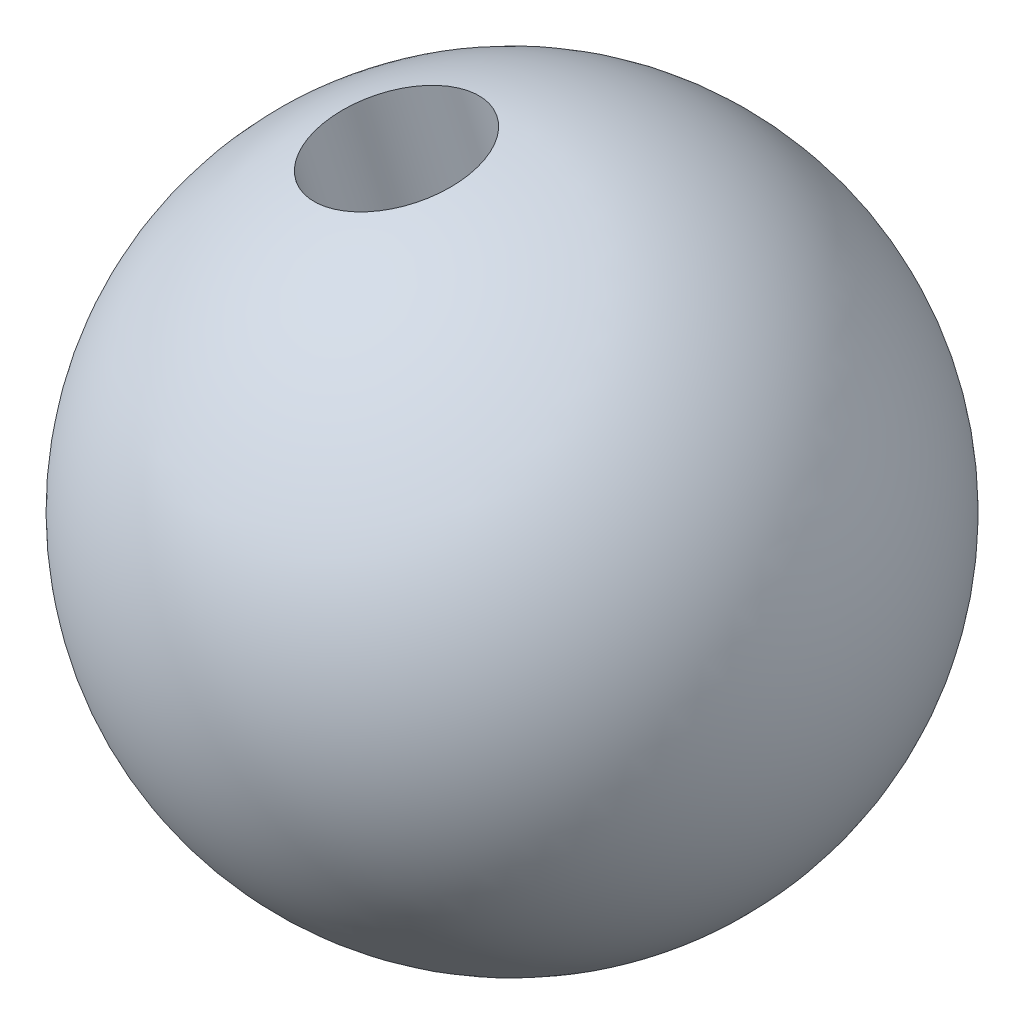
ISO-10303-21;
HEADER;
FILE_DESCRIPTION(('STEP AP214'),'2;1');
FILE_NAME('part.step','',(''),(''),'','','');
FILE_SCHEMA(('AUTOMOTIVE_DESIGN { 1 0 10303 214 1 1 1 1 }'));
ENDSEC;
DATA;
#1=APPLICATION_CONTEXT('core data for automotive mechanical design processes');
#2=APPLICATION_PROTOCOL_DEFINITION('international standard','automotive_design',2000,#1);
#3=PRODUCT_CONTEXT('',#1,'mechanical');
#4=PRODUCT('Part','Part','',(#3));
#5=PRODUCT_RELATED_PRODUCT_CATEGORY('part','',(#4));
#6=PRODUCT_DEFINITION_FORMATION('','',#4);
#7=PRODUCT_DEFINITION_CONTEXT('part definition',#1,'design');
#8=PRODUCT_DEFINITION('design','',#6,#7);
#9=PRODUCT_DEFINITION_SHAPE('','',#8);
#10=(LENGTH_UNIT() NAMED_UNIT(*) SI_UNIT(.MILLI.,.METRE.));
#11=(NAMED_UNIT(*) PLANE_ANGLE_UNIT() SI_UNIT($,.RADIAN.));
#12=(NAMED_UNIT(*) SI_UNIT($,.STERADIAN.) SOLID_ANGLE_UNIT());
#13=UNCERTAINTY_MEASURE_WITH_UNIT(LENGTH_MEASURE(1.E-05),#10,'distance_accuracy_value','');
#14=(GEOMETRIC_REPRESENTATION_CONTEXT(3) GLOBAL_UNCERTAINTY_ASSIGNED_CONTEXT((#13)) GLOBAL_UNIT_ASSIGNED_CONTEXT((#10,
#11,#12)) REPRESENTATION_CONTEXT('',''));
#15=CARTESIAN_POINT('',(0.,0.,0.));
#16=DIRECTION('',(0.,0.,1.));
#17=DIRECTION('',(1.,0.,0.));
#18=AXIS2_PLACEMENT_3D('',#15,#16,#17);
#19=CARTESIAN_POINT('',(0.,0.,0.));
#20=DIRECTION('',(0.0442370949323139,0.999021060554756,0.));
#21=DIRECTION('',(0.999021060554756,-0.0442370949323139,0.));
#22=AXIS2_PLACEMENT_3D('',#19,#20,#21);
#23=SPHERICAL_SURFACE('',#22,15.);
#24=CARTESIAN_POINT('',(0.,0.,0.));
#25=DIRECTION('',(0.193434460193344,-0.966858742885303,-0.166635173105681));
#26=DIRECTION('',(0.980568442852433,0.196177289414333,0.));
#27=AXIS2_PLACEMENT_3D('',#24,#25,#26);
#28=SPHERICAL_SURFACE('',#27,15.);
#29=CARTESIAN_POINT('',(-2.82599736109282,14.1254058517408,2.43447087448228));
#30=DIRECTION('',(0.193434460193344,-0.966858742885303,-0.166635173105681));
#31=DIRECTION('',(0.980568442852433,0.196177289414333,0.));
#32=AXIS2_PLACEMENT_3D('',#29,#30,#31);
#33=CIRCLE('',#32,3.4);
#34=CARTESIAN_POINT('',(0.507935344605445,14.7924086357496,2.43447087448228));
#35=VERTEX_POINT('',#34);
#36=EDGE_CURVE('E11',#35,#35,#33,.F.);
#37=ORIENTED_EDGE('',*,*,#36,.F.);
#38=EDGE_LOOP('',(#37));
#39=FACE_BOUND('',#38,.T.);
#40=ADVANCED_FACE('F35',(#39),#28,.T.);
#41=CARTESIAN_POINT('',(-0.395172308276319,1.97522096539173,0.340423345097751));
#42=DIRECTION('',(-0.193434460193344,0.966858742885303,0.166635173105681));
#43=DIRECTION('',(-0.980568442852433,-0.196177289414333,0.));
#44=AXIS2_PLACEMENT_3D('',#41,#42,#43);
#45=CONICAL_SURFACE('',#44,3.4,1.02974425867665);
#46=CARTESIAN_POINT('',(0.,0.,0.));
#47=VERTEX_POINT('',#46);
#48=VERTEX_LOOP('',#47);
#49=FACE_BOUND('',#48,.T.);
#50=CARTESIAN_POINT('',(-0.395172308276319,1.97522096539173,0.340423345097751));
#51=DIRECTION('',(-0.193434460193344,0.966858742885303,0.166635173105681));
#52=DIRECTION('',(-0.980568442852433,-0.196177289414333,0.));
#53=AXIS2_PLACEMENT_3D('',#50,#51,#52);
#54=CIRCLE('',#53,3.4);
#55=CARTESIAN_POINT('',(-3.72910501397459,1.308218181383,0.340423345097751));
#56=VERTEX_POINT('',#55);
#57=EDGE_CURVE('E41',#56,#56,#54,.T.);
#58=ORIENTED_EDGE('',*,*,#57,.T.);
#59=EDGE_LOOP('',(#58));
#60=FACE_BOUND('',#59,.T.);
#61=ADVANCED_FACE('F44',(#49,#60),#45,.F.);
#62=CARTESIAN_POINT('',(-2.90151690290016,14.5028811432796,2.49952759658521));
#63=DIRECTION('',(-0.193434460193344,0.966858742885303,0.166635173105681));
#64=DIRECTION('',(-0.980568442852433,-0.196177289414333,0.));
#65=AXIS2_PLACEMENT_3D('',#62,#63,#64);
#66=CYLINDRICAL_SURFACE('',#65,3.4);
#67=ORIENTED_EDGE('',*,*,#36,.T.);
#68=EDGE_LOOP('',(#67));
#69=FACE_BOUND('',#68,.T.);
#70=ORIENTED_EDGE('',*,*,#57,.F.);
#71=EDGE_LOOP('',(#70));
#72=FACE_BOUND('',#71,.T.);
#73=ADVANCED_FACE('F47',(#69,#72),#66,.F.);
#74=CLOSED_SHELL('',(#40,#61,#73));
#75=MANIFOLD_SOLID_BREP('B2',#74);
#76=ADVANCED_BREP_SHAPE_REPRESENTATION('',(#18,#75),#14);
#77=SHAPE_DEFINITION_REPRESENTATION(#9,#76);
ENDSEC;
END-ISO-10303-21;
